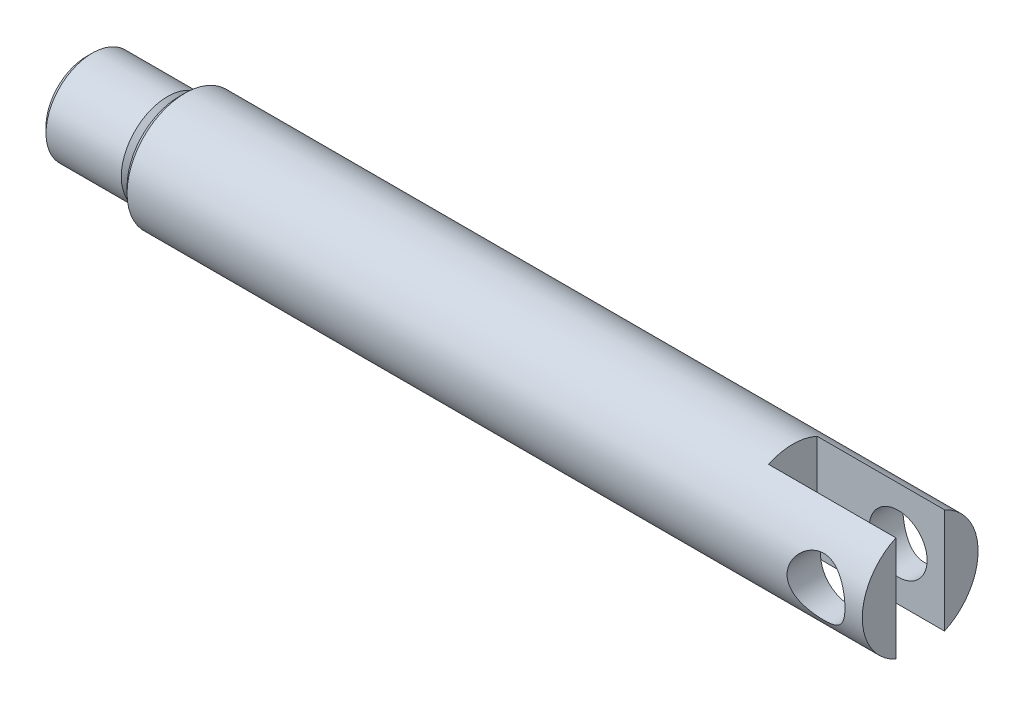
ISO-10303-21;
HEADER;
FILE_DESCRIPTION(('STEP AP214'),'2;1');
FILE_NAME('part.step','',(''),(''),'','','');
FILE_SCHEMA(('AUTOMOTIVE_DESIGN { 1 0 10303 214 1 1 1 1 }'));
ENDSEC;
DATA;
#1=APPLICATION_CONTEXT('core data for automotive mechanical design processes');
#2=APPLICATION_PROTOCOL_DEFINITION('international standard','automotive_design',2000,#1);
#3=PRODUCT_CONTEXT('',#1,'mechanical');
#4=PRODUCT('Part','Part','',(#3));
#5=PRODUCT_RELATED_PRODUCT_CATEGORY('part','',(#4));
#6=PRODUCT_DEFINITION_FORMATION('','',#4);
#7=PRODUCT_DEFINITION_CONTEXT('part definition',#1,'design');
#8=PRODUCT_DEFINITION('design','',#6,#7);
#9=PRODUCT_DEFINITION_SHAPE('','',#8);
#10=(LENGTH_UNIT() NAMED_UNIT(*) SI_UNIT(.MILLI.,.METRE.));
#11=(NAMED_UNIT(*) PLANE_ANGLE_UNIT() SI_UNIT($,.RADIAN.));
#12=(NAMED_UNIT(*) SI_UNIT($,.STERADIAN.) SOLID_ANGLE_UNIT());
#13=UNCERTAINTY_MEASURE_WITH_UNIT(LENGTH_MEASURE(1.E-05),#10,'distance_accuracy_value','');
#14=(GEOMETRIC_REPRESENTATION_CONTEXT(3) GLOBAL_UNCERTAINTY_ASSIGNED_CONTEXT((#13)) GLOBAL_UNIT_ASSIGNED_CONTEXT((#10,
#11,#12)) REPRESENTATION_CONTEXT('',''));
#15=CARTESIAN_POINT('',(0.,0.,0.));
#16=DIRECTION('',(0.,0.,1.));
#17=DIRECTION('',(1.,0.,0.));
#18=AXIS2_PLACEMENT_3D('',#15,#16,#17);
#19=CARTESIAN_POINT('',(36.,-2.5,0.));
#20=DIRECTION('',(1.,0.,0.));
#21=DIRECTION('',(0.,0.,-1.));
#22=AXIS2_PLACEMENT_3D('',#19,#20,#21);
#23=PLANE('',#22);
#24=DIRECTION('',(0.,1.,0.));
#25=VECTOR('',#24,1.);
#26=CARTESIAN_POINT('',(36.,-4.13797886955718,-1.05));
#27=LINE('',#26,#25);
#28=CARTESIAN_POINT('',(36.,-2.26881026090769,-1.05));
#29=VERTEX_POINT('',#28);
#30=CARTESIAN_POINT('',(36.,2.26881026090769,-1.05));
#31=VERTEX_POINT('',#30);
#32=EDGE_CURVE('E86',#29,#31,#27,.T.);
#33=ORIENTED_EDGE('',*,*,#32,.F.);
#34=CARTESIAN_POINT('',(36.,0.,0.));
#35=DIRECTION('',(-1.,0.,0.));
#36=DIRECTION('',(0.,0.,1.));
#37=AXIS2_PLACEMENT_3D('',#34,#35,#36);
#38=CIRCLE('',#37,2.5);
#39=EDGE_CURVE('E98',#31,#29,#38,.T.);
#40=ORIENTED_EDGE('',*,*,#39,.F.);
#41=EDGE_LOOP('',(#33,#40));
#42=FACE_BOUND('',#41,.T.);
#43=ADVANCED_FACE('F35',(#42),#23,.T.);
#44=CARTESIAN_POINT('',(34.,0.,-5.));
#45=DIRECTION('',(0.,0.,1.));
#46=DIRECTION('',(1.,0.,0.));
#47=AXIS2_PLACEMENT_3D('',#44,#45,#46);
#48=CYLINDRICAL_SURFACE('',#47,1.25);
#49=CARTESIAN_POINT('',(34.,0.,-1.05));
#50=DIRECTION('',(0.,0.,-1.));
#51=DIRECTION('',(-1.,0.,0.));
#52=AXIS2_PLACEMENT_3D('',#49,#50,#51);
#53=CIRCLE('',#52,1.25);
#54=CARTESIAN_POINT('',(32.75,0.,-1.05));
#55=VERTEX_POINT('',#54);
#56=EDGE_CURVE('E155',#55,#55,#53,.F.);
#57=ORIENTED_EDGE('',*,*,#56,.T.);
#58=EDGE_LOOP('',(#57));
#59=FACE_BOUND('',#58,.T.);
#60=CARTESIAN_POINT('',(35.25,0.,-2.5));
#61=CARTESIAN_POINT('',(35.2499958721006,-0.0657149536912332,-2.49999641755189));
#62=CARTESIAN_POINT('',(35.2447874085979,-0.131508249622541,-2.49738113774397));
#63=CARTESIAN_POINT('',(35.2241838995739,-0.261150294085533,-2.48717695046745));
#64=CARTESIAN_POINT('',(35.2087695087529,-0.324995108391881,-2.47957859786229));
#65=CARTESIAN_POINT('',(35.168507739229,-0.44866693110072,-2.46020349254139));
#66=CARTESIAN_POINT('',(35.14369701969,-0.508508503673977,-2.448442989719));
#67=CARTESIAN_POINT('',(35.0855367232938,-0.62309077100821,-2.42182220644723));
#68=CARTESIAN_POINT('',(35.0521878196889,-0.677831867487566,-2.40696217041912));
#69=CARTESIAN_POINT('',(34.9756034381434,-0.784384772202402,-2.37445322822571));
#70=CARTESIAN_POINT('',(34.9318919009504,-0.835819013902642,-2.3566899890942));
#71=CARTESIAN_POINT('',(34.8368481509412,-0.930974306083723,-2.3207496280843));
#72=CARTESIAN_POINT('',(34.7855101852844,-0.97468947888346,-2.30257220261294));
#73=CARTESIAN_POINT('',(34.6718958130958,-1.05656500056285,-2.26623688996684));
#74=CARTESIAN_POINT('',(34.6090798770676,-1.09403166943955,-2.24818983712665));
#75=CARTESIAN_POINT('',(34.4770408300172,-1.15771028361337,-2.21607473465401));
#76=CARTESIAN_POINT('',(34.4078223390966,-1.18393026870792,-2.20200384508737));
#77=CARTESIAN_POINT('',(34.2691686182226,-1.22266555273574,-2.1807233379726));
#78=CARTESIAN_POINT('',(34.1999944349157,-1.23590732135056,-2.17315339479642));
#79=CARTESIAN_POINT('',(34.0600264527756,-1.25053374163606,-2.16477362435659));
#80=CARTESIAN_POINT('',(33.989234323911,-1.25193011046635,-2.1639571167911));
#81=CARTESIAN_POINT('',(33.8571424696058,-1.24335910896537,-2.1688866282156));
#82=CARTESIAN_POINT('',(33.7957199609712,-1.23473069942103,-2.17385954577517));
#83=CARTESIAN_POINT('',(33.6753476132837,-1.20867481132117,-2.18845285917313));
#84=CARTESIAN_POINT('',(33.6163985683684,-1.19124452987207,-2.1980747353972));
#85=CARTESIAN_POINT('',(33.5009635842929,-1.14776222548251,-2.22109345515926));
#86=CARTESIAN_POINT('',(33.4445670015178,-1.121518833895,-2.23457300829998));
#87=CARTESIAN_POINT('',(33.3367071342625,-1.061302109585,-2.26379255351755));
#88=CARTESIAN_POINT('',(33.2852460804999,-1.02732530476559,-2.27953355975238));
#89=CARTESIAN_POINT('',(33.181848434071,-0.947582568640987,-2.31391447379107));
#90=CARTESIAN_POINT('',(33.1306789080298,-0.900868072961603,-2.33266887795933));
#91=CARTESIAN_POINT('',(33.0365807267614,-0.799444473426718,-2.36934529125509));
#92=CARTESIAN_POINT('',(32.9936560099576,-0.744731570717858,-2.38726689948501));
#93=CARTESIAN_POINT('',(32.9153929237128,-0.625645632289813,-2.42127484103705));
#94=CARTESIAN_POINT('',(32.8804994094428,-0.560941989499264,-2.43723730202509));
#95=CARTESIAN_POINT('',(32.8223787136962,-0.425582769361,-2.46447351401553));
#96=CARTESIAN_POINT('',(32.799142268731,-0.354931970331601,-2.47575098679441));
#97=CARTESIAN_POINT('',(32.7669057453541,-0.215958114575882,-2.49155417176795));
#98=CARTESIAN_POINT('',(32.7568859553165,-0.147926913185409,-2.4965617287664));
#99=CARTESIAN_POINT('',(32.7481690860819,-0.0109744999366934,-2.50091266823877));
#100=CARTESIAN_POINT('',(32.7494666429506,0.0579462748373765,-2.5002587340164));
#101=CARTESIAN_POINT('',(32.7627583605234,0.189041214982492,-2.49363990316801));
#102=CARTESIAN_POINT('',(32.7739156659125,0.251324260062442,-2.48809057110237));
#103=CARTESIAN_POINT('',(32.8052975898688,0.373008615377396,-2.47277714143524));
#104=CARTESIAN_POINT('',(32.8255232080667,0.432409607113746,-2.46301257917916));
#105=CARTESIAN_POINT('',(32.8749980830415,0.548610760562084,-2.43980314267087));
#106=CARTESIAN_POINT('',(32.904488812646,0.605287996257695,-2.42626102212424));
#107=CARTESIAN_POINT('',(32.9713844195575,0.713076702123655,-2.39679967896386));
#108=CARTESIAN_POINT('',(33.0087926682418,0.764185787219105,-2.38087944457231));
#109=CARTESIAN_POINT('',(33.0947005316661,0.864709611613318,-2.3463527667183));
#110=CARTESIAN_POINT('',(33.143928585567,0.9134650972808,-2.32763606060552));
#111=CARTESIAN_POINT('',(33.2499064390866,1.00232040139155,-2.29077989504843));
#112=CARTESIAN_POINT('',(33.3066613985205,1.04241423211355,-2.27264084226908));
#113=CARTESIAN_POINT('',(33.4295545677504,1.11463489312212,-2.23813990282585));
#114=CARTESIAN_POINT('',(33.4960140827607,1.1462818698483,-2.2219066207934));
#115=CARTESIAN_POINT('',(33.6343875846157,1.19760353251726,-2.19467590460157));
#116=CARTESIAN_POINT('',(33.7062944081265,1.21729364485947,-2.18367172800772));
#117=CARTESIAN_POINT('',(33.8461377785768,1.2423271093121,-2.16951876260833));
#118=CARTESIAN_POINT('',(33.9137928167863,1.24886624550108,-2.16571729325614));
#119=CARTESIAN_POINT('',(34.0493088339634,1.25086144297599,-2.16456693307718));
#120=CARTESIAN_POINT('',(34.1171697109243,1.2463223082805,-2.1672152453444));
#121=CARTESIAN_POINT('',(34.244354376915,1.22740765699033,-2.17797327562531));
#122=CARTESIAN_POINT('',(34.3038755876805,1.2140103929285,-2.18553868102992));
#123=CARTESIAN_POINT('',(34.4197601492809,1.17896919778081,-2.20463770234897));
#124=CARTESIAN_POINT('',(34.476122477615,1.15732261394977,-2.21617259462094));
#125=CARTESIAN_POINT('',(34.5882810637333,1.10476968162586,-2.2428566295566));
#126=CARTESIAN_POINT('',(34.6437848772871,1.07333892227057,-2.25819652995238));
#127=CARTESIAN_POINT('',(34.7490931702257,1.00268871454579,-2.29044164543238));
#128=CARTESIAN_POINT('',(34.7988946631481,0.963465214048313,-2.30734767243152));
#129=CARTESIAN_POINT('',(34.897677477947,0.872754158330807,-2.34327903949141));
#130=CARTESIAN_POINT('',(34.9458238779524,0.820355528762719,-2.36231229139336));
#131=CARTESIAN_POINT('',(35.0328287292795,0.707693507775353,-2.39847190318859));
#132=CARTESIAN_POINT('',(35.0716821742829,0.647425904070984,-2.4155972326005));
#133=CARTESIAN_POINT('',(35.1390454534528,0.519914496024935,-2.44622511981379));
#134=CARTESIAN_POINT('',(35.1674802117643,0.452624379918269,-2.45970120703636));
#135=CARTESIAN_POINT('',(35.2122602098987,0.313427626617741,-2.48126676704332));
#136=CARTESIAN_POINT('',(35.228639808537,0.24153474952896,-2.48937154216165));
#137=CARTESIAN_POINT('',(35.2423717638448,0.140752433104232,-2.49619327387079));
#138=CARTESIAN_POINT('',(35.2452283010795,0.112702349299375,-2.49761706674002));
#139=CARTESIAN_POINT('',(35.249043331896,0.056439664758948,-2.49952121222331));
#140=CARTESIAN_POINT('',(35.250001773089,0.0282270595592273,-2.50000153879704));
#141=CARTESIAN_POINT('',(35.25,0.,-2.5));
#142=B_SPLINE_CURVE_WITH_KNOTS('',3,(#60,#61,#62,#63,#64,#65,#66,#67,#68,#69,#70,#71,#72,#73,
#74,#75,#76,#77,#78,#79,#80,#81,#82,#83,#84,#85,#86,#87,#88,#89,#90,#91,#92,#93,#94,#95,#96,#97,
#98,#99,#100,#101,#102,#103,#104,#105,#106,#107,#108,#109,#110,#111,#112,#113,#114,#115,#116,
#117,#118,#119,#120,#121,#122,#123,#124,#125,#126,#127,#128,#129,#130,#131,#132,#133,#134,#135,
#136,#137,#138,#139,#140,#141),.UNSPECIFIED.,.T.,.F.,(4,2,2,2,2,2,2,2,2,2,2,2,2,2,2,2,2,2,2,2,2,
2,2,2,2,2,2,2,2,2,2,2,2,2,2,2,2,2,2,2,4),(0.,0.197030321775366,0.394435187136499,
0.591077694365378,0.78770470072696,0.996227198397613,1.20490779706755,1.42977158038441,
1.65447434872852,1.86572515175289,2.07676696661277,2.26257140511651,2.44843504907099,
2.63862800210611,2.82890651575278,3.04331176667349,3.25781918248359,3.48228777768052,
3.7065777114035,3.91229113089183,4.11790705639347,4.30758633132654,4.49728652038666,
4.69241070034875,4.88761813435425,5.10199513305525,5.31651985769292,5.54143352699595,
5.76605639925974,5.96911634372969,6.17208824825009,6.3557241280523,6.539419109796,
6.7354557096952,6.93159451423699,7.15156553440625,7.37165479220718,7.59330017078659,
7.81431135781165,7.89894100172125,7.98357298143561),.UNSPECIFIED.);
#143=CARTESIAN_POINT('',(35.25,0.,-2.5));
#144=VERTEX_POINT('',#143);
#145=EDGE_CURVE('E104',#144,#144,#142,.T.);
#146=ORIENTED_EDGE('',*,*,#145,.T.);
#147=EDGE_LOOP('',(#146));
#148=FACE_BOUND('',#147,.T.);
#149=ADVANCED_FACE('F135',(#59,#148),#48,.F.);
#150=CARTESIAN_POINT('',(0.,0.,0.));
#151=DIRECTION('',(-1.,0.,0.));
#152=DIRECTION('',(0.,0.,1.));
#153=AXIS2_PLACEMENT_3D('',#150,#151,#152);
#154=PLANE('',#153);
#155=CARTESIAN_POINT('',(0.,0.,0.));
#156=DIRECTION('',(-1.,0.,0.));
#157=DIRECTION('',(0.,0.,1.));
#158=AXIS2_PLACEMENT_3D('',#155,#156,#157);
#159=CIRCLE('',#158,1.75);
#160=CARTESIAN_POINT('',(0.,0.,1.75));
#161=VERTEX_POINT('',#160);
#162=EDGE_CURVE('E44',#161,#161,#159,.T.);
#163=ORIENTED_EDGE('',*,*,#162,.T.);
#164=EDGE_LOOP('',(#163));
#165=FACE_BOUND('',#164,.T.);
#166=ADVANCED_FACE('F149',(#165),#154,.T.);
#167=CARTESIAN_POINT('',(0.,0.,0.));
#168=DIRECTION('',(-1.,0.,0.));
#169=DIRECTION('',(0.,0.,1.));
#170=AXIS2_PLACEMENT_3D('',#167,#168,#169);
#171=CYLINDRICAL_SURFACE('',#170,2.);
#172=CARTESIAN_POINT('',(0.249999999999999,0.,0.));
#173=DIRECTION('',(-1.,0.,0.));
#174=DIRECTION('',(0.,0.,1.));
#175=AXIS2_PLACEMENT_3D('',#172,#173,#174);
#176=CIRCLE('',#175,2.);
#177=CARTESIAN_POINT('',(0.249999999999999,0.,2.));
#178=VERTEX_POINT('',#177);
#179=EDGE_CURVE('E11',#178,#178,#176,.F.);
#180=ORIENTED_EDGE('',*,*,#179,.T.);
#181=EDGE_LOOP('',(#180));
#182=FACE_BOUND('',#181,.T.);
#183=CARTESIAN_POINT('',(3.5,0.,0.));
#184=DIRECTION('',(-1.,0.,0.));
#185=DIRECTION('',(0.,0.,1.));
#186=AXIS2_PLACEMENT_3D('',#183,#184,#185);
#187=CIRCLE('',#186,2.);
#188=CARTESIAN_POINT('',(3.5,0.,2.));
#189=VERTEX_POINT('',#188);
#190=EDGE_CURVE('E112',#189,#189,#187,.T.);
#191=ORIENTED_EDGE('',*,*,#190,.T.);
#192=EDGE_LOOP('',(#191));
#193=FACE_BOUND('',#192,.T.);
#194=ADVANCED_FACE('F201',(#182,#193),#171,.T.);
#195=CARTESIAN_POINT('',(0.,0.,0.));
#196=DIRECTION('',(-1.,0.,0.));
#197=DIRECTION('',(0.,0.,1.));
#198=AXIS2_PLACEMENT_3D('',#195,#196,#197);
#199=CYLINDRICAL_SURFACE('',#198,1.75);
#200=CARTESIAN_POINT('',(3.75,0.,0.));
#201=DIRECTION('',(1.,0.,0.));
#202=DIRECTION('',(0.,0.,-1.));
#203=AXIS2_PLACEMENT_3D('',#200,#201,#202);
#204=CIRCLE('',#203,1.75);
#205=CARTESIAN_POINT('',(3.75,0.,-1.75));
#206=VERTEX_POINT('',#205);
#207=EDGE_CURVE('E222',#206,#206,#204,.T.);
#208=ORIENTED_EDGE('',*,*,#207,.T.);
#209=EDGE_LOOP('',(#208));
#210=FACE_BOUND('',#209,.T.);
#211=CARTESIAN_POINT('',(4.,0.,0.));
#212=DIRECTION('',(-1.,0.,0.));
#213=DIRECTION('',(0.,0.,1.));
#214=AXIS2_PLACEMENT_3D('',#211,#212,#213);
#215=CIRCLE('',#214,1.75);
#216=CARTESIAN_POINT('',(4.,0.,1.75));
#217=VERTEX_POINT('',#216);
#218=EDGE_CURVE('E102',#217,#217,#215,.T.);
#219=ORIENTED_EDGE('',*,*,#218,.T.);
#220=EDGE_LOOP('',(#219));
#221=FACE_BOUND('',#220,.T.);
#222=ADVANCED_FACE('F205',(#210,#221),#199,.T.);
#223=CARTESIAN_POINT('',(4.,-1.75,0.));
#224=DIRECTION('',(-1.,0.,0.));
#225=DIRECTION('',(0.,0.,1.));
#226=AXIS2_PLACEMENT_3D('',#223,#224,#225);
#227=PLANE('',#226);
#228=CARTESIAN_POINT('',(4.,0.,0.));
#229=DIRECTION('',(-1.,0.,0.));
#230=DIRECTION('',(0.,0.,1.));
#231=AXIS2_PLACEMENT_3D('',#228,#229,#230);
#232=CIRCLE('',#231,2.25);
#233=CARTESIAN_POINT('',(4.,0.,2.25));
#234=VERTEX_POINT('',#233);
#235=EDGE_CURVE('E216',#234,#234,#232,.T.);
#236=ORIENTED_EDGE('',*,*,#235,.T.);
#237=EDGE_LOOP('',(#236));
#238=FACE_BOUND('',#237,.T.);
#239=ORIENTED_EDGE('',*,*,#218,.F.);
#240=EDGE_LOOP('',(#239));
#241=FACE_BOUND('',#240,.T.);
#242=ADVANCED_FACE('F142',(#238,#241),#227,.T.);
#243=CARTESIAN_POINT('',(0.,0.,0.));
#244=DIRECTION('',(-1.,0.,0.));
#245=DIRECTION('',(0.,0.,1.));
#246=AXIS2_PLACEMENT_3D('',#243,#244,#245);
#247=CYLINDRICAL_SURFACE('',#246,2.5);
#248=CARTESIAN_POINT('',(4.25,0.,0.));
#249=DIRECTION('',(-1.,0.,0.));
#250=DIRECTION('',(0.,0.,1.));
#251=AXIS2_PLACEMENT_3D('',#248,#249,#250);
#252=CIRCLE('',#251,2.5);
#253=CARTESIAN_POINT('',(4.25,0.,2.5));
#254=VERTEX_POINT('',#253);
#255=EDGE_CURVE('E219',#254,#254,#252,.F.);
#256=ORIENTED_EDGE('',*,*,#255,.T.);
#257=EDGE_LOOP('',(#256));
#258=FACE_BOUND('',#257,.T.);
#259=DIRECTION('',(-1.,0.,0.));
#260=VECTOR('',#259,1.);
#261=CARTESIAN_POINT('',(0.,-2.26881026090769,-1.05));
#262=LINE('',#261,#260);
#263=CARTESIAN_POINT('',(30.5,-2.26881026090769,-1.05));
#264=VERTEX_POINT('',#263);
#265=EDGE_CURVE('E108',#264,#29,#262,.F.);
#266=ORIENTED_EDGE('',*,*,#265,.F.);
#267=CARTESIAN_POINT('',(30.5,0.,0.));
#268=DIRECTION('',(-1.,0.,0.));
#269=DIRECTION('',(0.,0.,1.));
#270=AXIS2_PLACEMENT_3D('',#267,#268,#269);
#271=CIRCLE('',#270,2.5);
#272=CARTESIAN_POINT('',(30.5,-2.26881026090769,1.05));
#273=VERTEX_POINT('',#272);
#274=EDGE_CURVE('E94',#273,#264,#271,.F.);
#275=ORIENTED_EDGE('',*,*,#274,.F.);
#276=DIRECTION('',(-1.,0.,0.));
#277=VECTOR('',#276,1.);
#278=CARTESIAN_POINT('',(0.,-2.26881026090769,1.05));
#279=LINE('',#278,#277);
#280=CARTESIAN_POINT('',(36.,-2.26881026090769,1.05));
#281=VERTEX_POINT('',#280);
#282=EDGE_CURVE('E80',#281,#273,#279,.T.);
#283=ORIENTED_EDGE('',*,*,#282,.F.);
#284=CARTESIAN_POINT('',(36.,2.26881026090769,1.05));
#285=VERTEX_POINT('',#284);
#286=EDGE_CURVE('E93',#281,#285,#38,.T.);
#287=ORIENTED_EDGE('',*,*,#286,.T.);
#288=DIRECTION('',(-1.,0.,0.));
#289=VECTOR('',#288,1.);
#290=CARTESIAN_POINT('',(0.,2.26881026090769,1.05));
#291=LINE('',#290,#289);
#292=CARTESIAN_POINT('',(30.5,2.26881026090769,1.05));
#293=VERTEX_POINT('',#292);
#294=EDGE_CURVE('E51',#293,#285,#291,.F.);
#295=ORIENTED_EDGE('',*,*,#294,.F.);
#296=CARTESIAN_POINT('',(30.5,2.26881026090769,-1.05));
#297=VERTEX_POINT('',#296);
#298=EDGE_CURVE('E115',#297,#293,#271,.F.);
#299=ORIENTED_EDGE('',*,*,#298,.F.);
#300=DIRECTION('',(-1.,0.,0.));
#301=VECTOR('',#300,1.);
#302=CARTESIAN_POINT('',(0.,2.26881026090769,-1.05));
#303=LINE('',#302,#301);
#304=EDGE_CURVE('E59',#31,#297,#303,.T.);
#305=ORIENTED_EDGE('',*,*,#304,.F.);
#306=ORIENTED_EDGE('',*,*,#39,.T.);
#307=EDGE_LOOP('',(#266,#275,#283,#287,#295,#299,#305,#306));
#308=FACE_BOUND('',#307,.T.);
#309=CARTESIAN_POINT('',(35.25,0.,2.5));
#310=CARTESIAN_POINT('',(35.2499958721006,0.0657149536912332,2.49999641755189));
#311=CARTESIAN_POINT('',(35.2447874085979,0.131508249622541,2.49738113774397));
#312=CARTESIAN_POINT('',(35.2241838995739,0.261150294085533,2.48717695046745));
#313=CARTESIAN_POINT('',(35.2087695087529,0.324995108391881,2.47957859786229));
#314=CARTESIAN_POINT('',(35.168507739229,0.44866693110072,2.46020349254139));
#315=CARTESIAN_POINT('',(35.14369701969,0.508508503673977,2.448442989719));
#316=CARTESIAN_POINT('',(35.0855367232938,0.62309077100821,2.42182220644723));
#317=CARTESIAN_POINT('',(35.0521878196889,0.677831867487566,2.40696217041912));
#318=CARTESIAN_POINT('',(34.9756034381434,0.784384772202402,2.37445322822571));
#319=CARTESIAN_POINT('',(34.9318919009504,0.835819013902642,2.3566899890942));
#320=CARTESIAN_POINT('',(34.8368481509412,0.930974306083723,2.3207496280843));
#321=CARTESIAN_POINT('',(34.7855101852844,0.97468947888346,2.30257220261294));
#322=CARTESIAN_POINT('',(34.6718958130958,1.05656500056285,2.26623688996684));
#323=CARTESIAN_POINT('',(34.6090798770676,1.09403166943955,2.24818983712665));
#324=CARTESIAN_POINT('',(34.4770408300172,1.15771028361337,2.21607473465401));
#325=CARTESIAN_POINT('',(34.4078223390966,1.18393026870792,2.20200384508737));
#326=CARTESIAN_POINT('',(34.2691686182226,1.22266555273574,2.1807233379726));
#327=CARTESIAN_POINT('',(34.1999944349157,1.23590732135056,2.17315339479642));
#328=CARTESIAN_POINT('',(34.0600264527756,1.25053374163606,2.16477362435659));
#329=CARTESIAN_POINT('',(33.989234323911,1.25193011046635,2.1639571167911));
#330=CARTESIAN_POINT('',(33.8571424696058,1.24335910896537,2.1688866282156));
#331=CARTESIAN_POINT('',(33.7957199609712,1.23473069942103,2.17385954577517));
#332=CARTESIAN_POINT('',(33.6753476132837,1.20867481132117,2.18845285917313));
#333=CARTESIAN_POINT('',(33.6163985683684,1.19124452987207,2.1980747353972));
#334=CARTESIAN_POINT('',(33.5009635842929,1.14776222548251,2.22109345515926));
#335=CARTESIAN_POINT('',(33.4445670015178,1.121518833895,2.23457300829998));
#336=CARTESIAN_POINT('',(33.3367071342625,1.061302109585,2.26379255351755));
#337=CARTESIAN_POINT('',(33.2852460804999,1.02732530476559,2.27953355975238));
#338=CARTESIAN_POINT('',(33.181848434071,0.947582568640987,2.31391447379107));
#339=CARTESIAN_POINT('',(33.1306789080298,0.900868072961603,2.33266887795933));
#340=CARTESIAN_POINT('',(33.0365807267614,0.799444473426718,2.36934529125509));
#341=CARTESIAN_POINT('',(32.9936560099576,0.744731570717858,2.38726689948501));
#342=CARTESIAN_POINT('',(32.9153929237128,0.625645632289813,2.42127484103705));
#343=CARTESIAN_POINT('',(32.8804994094428,0.560941989499264,2.43723730202509));
#344=CARTESIAN_POINT('',(32.8223787136962,0.425582769361,2.46447351401553));
#345=CARTESIAN_POINT('',(32.799142268731,0.354931970331601,2.47575098679441));
#346=CARTESIAN_POINT('',(32.7669057453541,0.215958114575882,2.49155417176795));
#347=CARTESIAN_POINT('',(32.7568859553165,0.147926913185409,2.4965617287664));
#348=CARTESIAN_POINT('',(32.7481690860819,0.0109744999366934,2.50091266823877));
#349=CARTESIAN_POINT('',(32.7494666429506,-0.0579462748373765,2.5002587340164));
#350=CARTESIAN_POINT('',(32.7627583605234,-0.189041214982492,2.49363990316801));
#351=CARTESIAN_POINT('',(32.7739156659125,-0.251324260062442,2.48809057110237));
#352=CARTESIAN_POINT('',(32.8052975898688,-0.373008615377396,2.47277714143524));
#353=CARTESIAN_POINT('',(32.8255232080667,-0.432409607113746,2.46301257917916));
#354=CARTESIAN_POINT('',(32.8749980830415,-0.548610760562084,2.43980314267087));
#355=CARTESIAN_POINT('',(32.904488812646,-0.605287996257695,2.42626102212424));
#356=CARTESIAN_POINT('',(32.9713844195575,-0.713076702123655,2.39679967896386));
#357=CARTESIAN_POINT('',(33.0087926682418,-0.764185787219105,2.38087944457231));
#358=CARTESIAN_POINT('',(33.0947005316661,-0.864709611613318,2.3463527667183));
#359=CARTESIAN_POINT('',(33.143928585567,-0.9134650972808,2.32763606060552));
#360=CARTESIAN_POINT('',(33.2499064390866,-1.00232040139155,2.29077989504843));
#361=CARTESIAN_POINT('',(33.3066613985205,-1.04241423211355,2.27264084226908));
#362=CARTESIAN_POINT('',(33.4295545677504,-1.11463489312212,2.23813990282585));
#363=CARTESIAN_POINT('',(33.4960140827607,-1.1462818698483,2.2219066207934));
#364=CARTESIAN_POINT('',(33.6343875846157,-1.19760353251726,2.19467590460157));
#365=CARTESIAN_POINT('',(33.7062944081265,-1.21729364485947,2.18367172800772));
#366=CARTESIAN_POINT('',(33.8461377785768,-1.2423271093121,2.16951876260833));
#367=CARTESIAN_POINT('',(33.9137928167863,-1.24886624550108,2.16571729325614));
#368=CARTESIAN_POINT('',(34.0493088339634,-1.25086144297599,2.16456693307718));
#369=CARTESIAN_POINT('',(34.1171697109243,-1.2463223082805,2.1672152453444));
#370=CARTESIAN_POINT('',(34.244354376915,-1.22740765699033,2.17797327562531));
#371=CARTESIAN_POINT('',(34.3038755876805,-1.2140103929285,2.18553868102992));
#372=CARTESIAN_POINT('',(34.4197601492809,-1.17896919778081,2.20463770234897));
#373=CARTESIAN_POINT('',(34.476122477615,-1.15732261394977,2.21617259462094));
#374=CARTESIAN_POINT('',(34.5882810637333,-1.10476968162586,2.2428566295566));
#375=CARTESIAN_POINT('',(34.6437848772871,-1.07333892227057,2.25819652995238));
#376=CARTESIAN_POINT('',(34.7490931702257,-1.00268871454579,2.29044164543238));
#377=CARTESIAN_POINT('',(34.7988946631481,-0.963465214048313,2.30734767243152));
#378=CARTESIAN_POINT('',(34.897677477947,-0.872754158330807,2.34327903949141));
#379=CARTESIAN_POINT('',(34.9458238779524,-0.820355528762719,2.36231229139336));
#380=CARTESIAN_POINT('',(35.0328287292795,-0.707693507775353,2.39847190318859));
#381=CARTESIAN_POINT('',(35.0716821742829,-0.647425904070984,2.4155972326005));
#382=CARTESIAN_POINT('',(35.1390454534528,-0.519914496024935,2.44622511981379));
#383=CARTESIAN_POINT('',(35.1674802117643,-0.452624379918269,2.45970120703636));
#384=CARTESIAN_POINT('',(35.2122602098987,-0.313427626617741,2.48126676704332));
#385=CARTESIAN_POINT('',(35.228639808537,-0.24153474952896,2.48937154216165));
#386=CARTESIAN_POINT('',(35.2423717638448,-0.140752433104232,2.49619327387079));
#387=CARTESIAN_POINT('',(35.2452283010795,-0.112702349299375,2.49761706674002));
#388=CARTESIAN_POINT('',(35.249043331896,-0.056439664758948,2.49952121222331));
#389=CARTESIAN_POINT('',(35.250001773089,-0.0282270595592273,2.50000153879704));
#390=CARTESIAN_POINT('',(35.25,0.,2.5));
#391=B_SPLINE_CURVE_WITH_KNOTS('',3,(#309,#310,#311,#312,#313,#314,#315,#316,#317,#318,#319,
#320,#321,#322,#323,#324,#325,#326,#327,#328,#329,#330,#331,#332,#333,#334,#335,#336,#337,#338,
#339,#340,#341,#342,#343,#344,#345,#346,#347,#348,#349,#350,#351,#352,#353,#354,#355,#356,#357,
#358,#359,#360,#361,#362,#363,#364,#365,#366,#367,#368,#369,#370,#371,#372,#373,#374,#375,#376,
#377,#378,#379,#380,#381,#382,#383,#384,#385,#386,#387,#388,#389,#390),.UNSPECIFIED.,.T.,.F.,(4,
2,2,2,2,2,2,2,2,2,2,2,2,2,2,2,2,2,2,2,2,2,2,2,2,2,2,2,2,2,2,2,2,2,2,2,2,2,2,2,4),(0.,
0.197030321775366,0.394435187136499,0.591077694365378,0.78770470072696,0.996227198397613,
1.20490779706755,1.42977158038441,1.65447434872852,1.86572515175289,2.07676696661277,
2.26257140511651,2.44843504907099,2.63862800210611,2.82890651575278,3.04331176667349,
3.25781918248359,3.48228777768052,3.7065777114035,3.91229113089183,4.11790705639347,
4.30758633132654,4.49728652038666,4.69241070034875,4.88761813435425,5.10199513305525,
5.31651985769292,5.54143352699595,5.76605639925974,5.96911634372969,6.17208824825009,
6.3557241280523,6.539419109796,6.7354557096952,6.93159451423699,7.15156553440625,
7.37165479220718,7.59330017078659,7.81431135781165,7.89894100172125,7.98357298143561),.UNSPECIFIED.);
#392=CARTESIAN_POINT('',(35.25,0.,2.5));
#393=VERTEX_POINT('',#392);
#394=EDGE_CURVE('E99',#393,#393,#391,.T.);
#395=ORIENTED_EDGE('',*,*,#394,.F.);
#396=EDGE_LOOP('',(#395));
#397=FACE_BOUND('',#396,.T.);
#398=ORIENTED_EDGE('',*,*,#145,.F.);
#399=EDGE_LOOP('',(#398));
#400=FACE_BOUND('',#399,.T.);
#401=ADVANCED_FACE('F91',(#258,#308,#397,#400),#247,.T.);
#402=DIRECTION('',(0.,-1.,0.));
#403=VECTOR('',#402,1.);
#404=CARTESIAN_POINT('',(36.,-4.13797886955718,1.05));
#405=LINE('',#404,#403);
#406=EDGE_CURVE('E76',#285,#281,#405,.T.);
#407=ORIENTED_EDGE('',*,*,#406,.F.);
#408=ORIENTED_EDGE('',*,*,#286,.F.);
#409=EDGE_LOOP('',(#407,#408));
#410=FACE_BOUND('',#409,.T.);
#411=ADVANCED_FACE('F97',(#410),#23,.T.);
#412=CARTESIAN_POINT('',(34.,0.,1.05));
#413=DIRECTION('',(0.,0.,1.));
#414=DIRECTION('',(1.,0.,0.));
#415=AXIS2_PLACEMENT_3D('',#412,#413,#414);
#416=CIRCLE('',#415,1.25);
#417=CARTESIAN_POINT('',(35.25,0.,1.05));
#418=VERTEX_POINT('',#417);
#419=EDGE_CURVE('E95',#418,#418,#416,.F.);
#420=ORIENTED_EDGE('',*,*,#419,.T.);
#421=EDGE_LOOP('',(#420));
#422=FACE_BOUND('',#421,.T.);
#423=ORIENTED_EDGE('',*,*,#394,.T.);
#424=EDGE_LOOP('',(#423));
#425=FACE_BOUND('',#424,.T.);
#426=ADVANCED_FACE('F129',(#422,#425),#48,.F.);
#427=CARTESIAN_POINT('',(30.5,-4.13797886955718,-1.05));
#428=DIRECTION('',(0.,0.,-1.));
#429=DIRECTION('',(-1.,0.,0.));
#430=AXIS2_PLACEMENT_3D('',#427,#428,#429);
#431=PLANE('',#430);
#432=ORIENTED_EDGE('',*,*,#265,.T.);
#433=ORIENTED_EDGE('',*,*,#32,.T.);
#434=ORIENTED_EDGE('',*,*,#304,.T.);
#435=DIRECTION('',(0.,1.,0.));
#436=VECTOR('',#435,1.);
#437=CARTESIAN_POINT('',(30.5,-4.13797886955718,-1.05));
#438=LINE('',#437,#436);
#439=EDGE_CURVE('E85',#264,#297,#438,.T.);
#440=ORIENTED_EDGE('',*,*,#439,.F.);
#441=EDGE_LOOP('',(#432,#433,#434,#440));
#442=FACE_BOUND('',#441,.T.);
#443=ORIENTED_EDGE('',*,*,#56,.F.);
#444=EDGE_LOOP('',(#443));
#445=FACE_BOUND('',#444,.T.);
#446=ADVANCED_FACE('F133',(#442,#445),#431,.F.);
#447=CARTESIAN_POINT('',(30.5,-4.13797886955718,1.05));
#448=DIRECTION('',(0.,0.,1.));
#449=DIRECTION('',(1.,0.,0.));
#450=AXIS2_PLACEMENT_3D('',#447,#448,#449);
#451=PLANE('',#450);
#452=ORIENTED_EDGE('',*,*,#294,.T.);
#453=ORIENTED_EDGE('',*,*,#406,.T.);
#454=ORIENTED_EDGE('',*,*,#282,.T.);
#455=DIRECTION('',(0.,-1.,0.));
#456=VECTOR('',#455,1.);
#457=CARTESIAN_POINT('',(30.5,-4.13797886955718,1.05));
#458=LINE('',#457,#456);
#459=EDGE_CURVE('E160',#293,#273,#458,.T.);
#460=ORIENTED_EDGE('',*,*,#459,.F.);
#461=EDGE_LOOP('',(#452,#453,#454,#460));
#462=FACE_BOUND('',#461,.T.);
#463=ORIENTED_EDGE('',*,*,#419,.F.);
#464=EDGE_LOOP('',(#463));
#465=FACE_BOUND('',#464,.T.);
#466=ADVANCED_FACE('F78',(#462,#465),#451,.F.);
#467=CARTESIAN_POINT('',(30.5,0.,0.));
#468=DIRECTION('',(-1.,0.,0.));
#469=DIRECTION('',(0.,0.,1.));
#470=AXIS2_PLACEMENT_3D('',#467,#468,#469);
#471=PLANE('',#470);
#472=ORIENTED_EDGE('',*,*,#274,.T.);
#473=ORIENTED_EDGE('',*,*,#439,.T.);
#474=ORIENTED_EDGE('',*,*,#298,.T.);
#475=ORIENTED_EDGE('',*,*,#459,.T.);
#476=EDGE_LOOP('',(#472,#473,#474,#475));
#477=FACE_BOUND('',#476,.T.);
#478=ADVANCED_FACE('F163',(#477),#471,.F.);
#479=CARTESIAN_POINT('',(4.,0.,0.));
#480=DIRECTION('',(1.,0.,0.));
#481=DIRECTION('',(0.,0.,-1.));
#482=AXIS2_PLACEMENT_3D('',#479,#480,#481);
#483=CONICAL_SURFACE('',#482,2.25,0.785398163397444);
#484=ORIENTED_EDGE('',*,*,#255,.F.);
#485=EDGE_LOOP('',(#484));
#486=FACE_BOUND('',#485,.T.);
#487=ORIENTED_EDGE('',*,*,#235,.F.);
#488=EDGE_LOOP('',(#487));
#489=FACE_BOUND('',#488,.T.);
#490=ADVANCED_FACE('F176',(#486,#489),#483,.T.);
#491=CARTESIAN_POINT('',(3.5,0.,0.));
#492=DIRECTION('',(-1.,0.,0.));
#493=DIRECTION('',(0.,0.,1.));
#494=AXIS2_PLACEMENT_3D('',#491,#492,#493);
#495=CONICAL_SURFACE('',#494,2.,0.785398163397453);
#496=ORIENTED_EDGE('',*,*,#207,.F.);
#497=EDGE_LOOP('',(#496));
#498=FACE_BOUND('',#497,.T.);
#499=ORIENTED_EDGE('',*,*,#190,.F.);
#500=EDGE_LOOP('',(#499));
#501=FACE_BOUND('',#500,.T.);
#502=ADVANCED_FACE('F181',(#498,#501),#495,.T.);
#503=CARTESIAN_POINT('',(0.,0.,0.));
#504=DIRECTION('',(1.,0.,0.));
#505=DIRECTION('',(0.,0.,-1.));
#506=AXIS2_PLACEMENT_3D('',#503,#504,#505);
#507=CONICAL_SURFACE('',#506,1.75,0.785398163397448);
#508=ORIENTED_EDGE('',*,*,#179,.F.);
#509=EDGE_LOOP('',(#508));
#510=FACE_BOUND('',#509,.T.);
#511=ORIENTED_EDGE('',*,*,#162,.F.);
#512=EDGE_LOOP('',(#511));
#513=FACE_BOUND('',#512,.T.);
#514=ADVANCED_FACE('F38',(#510,#513),#507,.T.);
#515=CLOSED_SHELL('',(#43,#149,#166,#194,#222,#242,#401,#411,#426,#446,#466,#478,#490,#502,#514));
#516=MANIFOLD_SOLID_BREP('B2',#515);
#517=ADVANCED_BREP_SHAPE_REPRESENTATION('',(#18,#516),#14);
#518=SHAPE_DEFINITION_REPRESENTATION(#9,#517);
ENDSEC;
END-ISO-10303-21;
